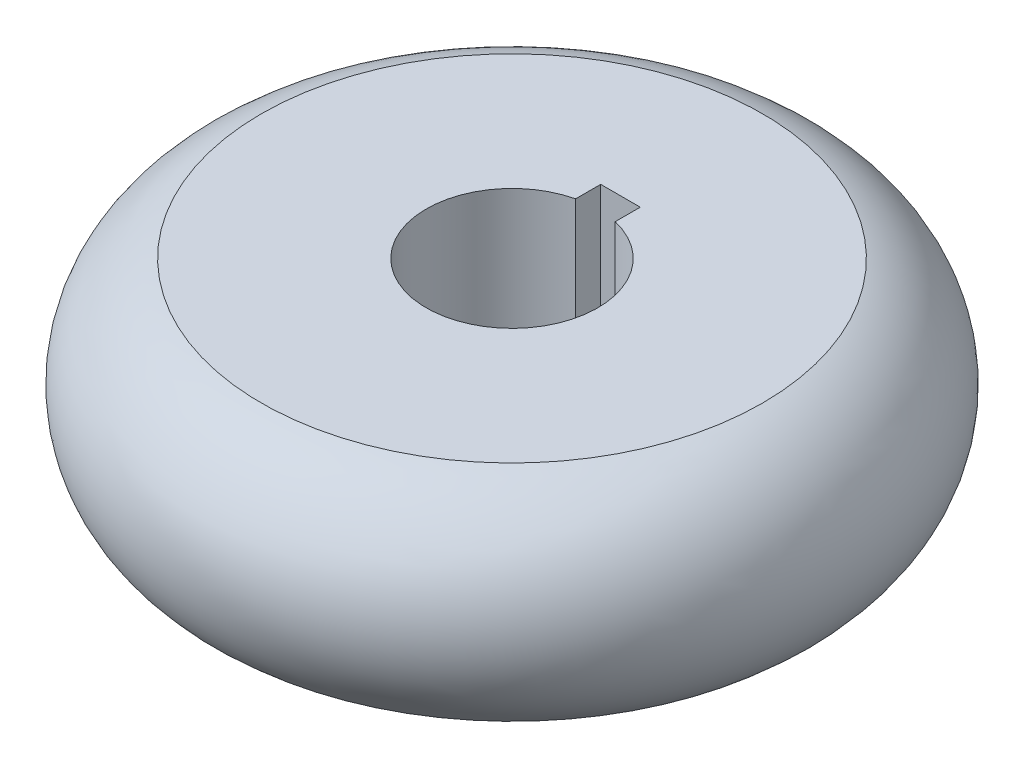
ISO-10303-21;
HEADER;
FILE_DESCRIPTION(('STEP AP214'),'2;1');
FILE_NAME('part.step','',(''),(''),'','','');
FILE_SCHEMA(('AUTOMOTIVE_DESIGN { 1 0 10303 214 1 1 1 1 }'));
ENDSEC;
DATA;
#1=APPLICATION_CONTEXT('core data for automotive mechanical design processes');
#2=APPLICATION_PROTOCOL_DEFINITION('international standard','automotive_design',2000,#1);
#3=PRODUCT_CONTEXT('',#1,'mechanical');
#4=PRODUCT('Part','Part','',(#3));
#5=PRODUCT_RELATED_PRODUCT_CATEGORY('part','',(#4));
#6=PRODUCT_DEFINITION_FORMATION('','',#4);
#7=PRODUCT_DEFINITION_CONTEXT('part definition',#1,'design');
#8=PRODUCT_DEFINITION('design','',#6,#7);
#9=PRODUCT_DEFINITION_SHAPE('','',#8);
#10=(LENGTH_UNIT() NAMED_UNIT(*) SI_UNIT(.MILLI.,.METRE.));
#11=(NAMED_UNIT(*) PLANE_ANGLE_UNIT() SI_UNIT($,.RADIAN.));
#12=(NAMED_UNIT(*) SI_UNIT($,.STERADIAN.) SOLID_ANGLE_UNIT());
#13=UNCERTAINTY_MEASURE_WITH_UNIT(LENGTH_MEASURE(1.E-05),#10,'distance_accuracy_value','');
#14=(GEOMETRIC_REPRESENTATION_CONTEXT(3) GLOBAL_UNCERTAINTY_ASSIGNED_CONTEXT((#13)) GLOBAL_UNIT_ASSIGNED_CONTEXT((#10,
#11,#12)) REPRESENTATION_CONTEXT('',''));
#15=CARTESIAN_POINT('',(0.,0.,0.));
#16=DIRECTION('',(0.,0.,1.));
#17=DIRECTION('',(1.,0.,0.));
#18=AXIS2_PLACEMENT_3D('',#15,#16,#17);
#19=CARTESIAN_POINT('',(-1.50000000000001,8.25,-8.22455532033676));
#20=DIRECTION('',(-1.,0.,0.));
#21=DIRECTION('',(0.,0.,1.));
#22=AXIS2_PLACEMENT_3D('',#19,#20,#21);
#23=PLANE('',#22);
#24=DIRECTION('',(0.,1.,0.));
#25=VECTOR('',#24,1.);
#26=CARTESIAN_POINT('',(-1.5,8.25,-8.22455532033676));
#27=LINE('',#26,#25);
#28=CARTESIAN_POINT('',(-1.5,-8.25,-8.22455532033676));
#29=VERTEX_POINT('',#28);
#30=CARTESIAN_POINT('',(-1.5,8.24999999999999,-8.22455532033676));
#31=VERTEX_POINT('',#30);
#32=EDGE_CURVE('E63',#29,#31,#27,.T.);
#33=ORIENTED_EDGE('',*,*,#32,.T.);
#34=DIRECTION('',(0.,0.,1.));
#35=VECTOR('',#34,1.);
#36=CARTESIAN_POINT('',(-1.5,8.24999999999999,0.));
#37=LINE('',#36,#35);
#38=CARTESIAN_POINT('',(-1.5,8.25,-6.32455532033676));
#39=VERTEX_POINT('',#38);
#40=EDGE_CURVE('E77',#39,#31,#37,.F.);
#41=ORIENTED_EDGE('',*,*,#40,.F.);
#42=DIRECTION('',(0.,1.,0.));
#43=VECTOR('',#42,1.);
#44=CARTESIAN_POINT('',(-1.5,0.,-6.32455532033676));
#45=LINE('',#44,#43);
#46=CARTESIAN_POINT('',(-1.5,-8.25,-6.32455532033676));
#47=VERTEX_POINT('',#46);
#48=EDGE_CURVE('E64',#39,#47,#45,.F.);
#49=ORIENTED_EDGE('',*,*,#48,.T.);
#50=DIRECTION('',(0.,0.,-1.));
#51=VECTOR('',#50,1.);
#52=CARTESIAN_POINT('',(-1.5,-8.25,0.));
#53=LINE('',#52,#51);
#54=EDGE_CURVE('E71',#29,#47,#53,.F.);
#55=ORIENTED_EDGE('',*,*,#54,.F.);
#56=EDGE_LOOP('',(#33,#41,#49,#55));
#57=FACE_BOUND('',#56,.T.);
#58=ADVANCED_FACE('F17',(#57),#23,.F.);
#59=CARTESIAN_POINT('',(0.,0.,0.));
#60=DIRECTION('',(0.,1.,0.));
#61=DIRECTION('',(-1.,0.,0.));
#62=AXIS2_PLACEMENT_3D('',#59,#60,#61);
#63=CYLINDRICAL_SURFACE('',#62,6.5);
#64=CARTESIAN_POINT('',(0.,8.25,0.));
#65=DIRECTION('',(0.,1.,0.));
#66=DIRECTION('',(-1.,0.,0.));
#67=AXIS2_PLACEMENT_3D('',#64,#65,#66);
#68=CIRCLE('',#67,6.5);
#69=CARTESIAN_POINT('',(1.49999999999999,8.25,-6.32455532033676));
#70=VERTEX_POINT('',#69);
#71=EDGE_CURVE('E20',#70,#39,#68,.F.);
#72=ORIENTED_EDGE('',*,*,#71,.F.);
#73=DIRECTION('',(0.,1.,0.));
#74=VECTOR('',#73,1.);
#75=CARTESIAN_POINT('',(1.49999999999999,8.25,-6.32455532033676));
#76=LINE('',#75,#74);
#77=CARTESIAN_POINT('',(1.5,-8.25,-6.32455532033676));
#78=VERTEX_POINT('',#77);
#79=EDGE_CURVE('E52',#70,#78,#76,.F.);
#80=ORIENTED_EDGE('',*,*,#79,.T.);
#81=CARTESIAN_POINT('',(0.,-8.25,0.));
#82=DIRECTION('',(0.,1.,0.));
#83=DIRECTION('',(-1.,0.,0.));
#84=AXIS2_PLACEMENT_3D('',#81,#82,#83);
#85=CIRCLE('',#84,6.5);
#86=EDGE_CURVE('E103',#47,#78,#85,.T.);
#87=ORIENTED_EDGE('',*,*,#86,.F.);
#88=ORIENTED_EDGE('',*,*,#48,.F.);
#89=EDGE_LOOP('',(#72,#80,#87,#88));
#90=FACE_BOUND('',#89,.T.);
#91=ADVANCED_FACE('F68',(#90),#63,.F.);
#92=CARTESIAN_POINT('',(1.49999999999999,8.25,-6.32455532033676));
#93=DIRECTION('',(1.,0.,0.));
#94=DIRECTION('',(0.,0.,-1.));
#95=AXIS2_PLACEMENT_3D('',#92,#93,#94);
#96=PLANE('',#95);
#97=ORIENTED_EDGE('',*,*,#79,.F.);
#98=DIRECTION('',(0.,0.,1.));
#99=VECTOR('',#98,1.);
#100=CARTESIAN_POINT('',(1.49999999999999,8.24999999999999,0.));
#101=LINE('',#100,#99);
#102=CARTESIAN_POINT('',(1.49999999999999,8.24999999999999,-8.22455532033676));
#103=VERTEX_POINT('',#102);
#104=EDGE_CURVE('E56',#103,#70,#101,.T.);
#105=ORIENTED_EDGE('',*,*,#104,.F.);
#106=DIRECTION('',(0.,1.,0.));
#107=VECTOR('',#106,1.);
#108=CARTESIAN_POINT('',(1.49999999999999,8.25,-8.22455532033676));
#109=LINE('',#108,#107);
#110=CARTESIAN_POINT('',(1.5,-8.25,-8.22455532033676));
#111=VERTEX_POINT('',#110);
#112=EDGE_CURVE('E35',#103,#111,#109,.F.);
#113=ORIENTED_EDGE('',*,*,#112,.T.);
#114=DIRECTION('',(0.,0.,-1.));
#115=VECTOR('',#114,1.);
#116=CARTESIAN_POINT('',(1.5,-8.25,0.));
#117=LINE('',#116,#115);
#118=EDGE_CURVE('E59',#78,#111,#117,.T.);
#119=ORIENTED_EDGE('',*,*,#118,.F.);
#120=EDGE_LOOP('',(#97,#105,#113,#119));
#121=FACE_BOUND('',#120,.T.);
#122=ADVANCED_FACE('F54',(#121),#96,.F.);
#123=CARTESIAN_POINT('',(1.49999999999999,8.25,-8.22455532033676));
#124=DIRECTION('',(0.,0.,-1.));
#125=DIRECTION('',(-1.,0.,0.));
#126=AXIS2_PLACEMENT_3D('',#123,#124,#125);
#127=PLANE('',#126);
#128=ORIENTED_EDGE('',*,*,#112,.F.);
#129=DIRECTION('',(1.,0.,0.));
#130=VECTOR('',#129,1.);
#131=CARTESIAN_POINT('',(-12.75,8.24999999999999,-8.22455532033676));
#132=LINE('',#131,#130);
#133=EDGE_CURVE('E75',#31,#103,#132,.T.);
#134=ORIENTED_EDGE('',*,*,#133,.F.);
#135=ORIENTED_EDGE('',*,*,#32,.F.);
#136=DIRECTION('',(1.,0.,0.));
#137=VECTOR('',#136,1.);
#138=CARTESIAN_POINT('',(-12.75,-8.25,-8.22455532033676));
#139=LINE('',#138,#137);
#140=EDGE_CURVE('E88',#111,#29,#139,.F.);
#141=ORIENTED_EDGE('',*,*,#140,.F.);
#142=EDGE_LOOP('',(#128,#134,#135,#141));
#143=FACE_BOUND('',#142,.T.);
#144=ADVANCED_FACE('F121',(#143),#127,.F.);
#145=CARTESIAN_POINT('',(-12.75,8.24999999999999,0.));
#146=DIRECTION('',(0.,1.,0.));
#147=DIRECTION('',(0.,0.,1.));
#148=AXIS2_PLACEMENT_3D('',#145,#146,#147);
#149=PLANE('',#148);
#150=ORIENTED_EDGE('',*,*,#104,.T.);
#151=ORIENTED_EDGE('',*,*,#71,.T.);
#152=ORIENTED_EDGE('',*,*,#40,.T.);
#153=ORIENTED_EDGE('',*,*,#133,.T.);
#154=EDGE_LOOP('',(#150,#151,#152,#153));
#155=FACE_BOUND('',#154,.T.);
#156=CARTESIAN_POINT('',(0.,8.25,0.));
#157=DIRECTION('',(0.,1.,0.));
#158=DIRECTION('',(-1.,0.,0.));
#159=AXIS2_PLACEMENT_3D('',#156,#157,#158);
#160=CIRCLE('',#159,19.);
#161=CARTESIAN_POINT('',(-19.,8.24999999999999,0.));
#162=VERTEX_POINT('',#161);
#163=EDGE_CURVE('E26',#162,#162,#160,.F.);
#164=ORIENTED_EDGE('',*,*,#163,.F.);
#165=EDGE_LOOP('',(#164));
#166=FACE_BOUND('',#165,.T.);
#167=ADVANCED_FACE('F72',(#155,#166),#149,.T.);
#168=CARTESIAN_POINT('',(-12.75,-8.25,0.));
#169=DIRECTION('',(0.,-1.,0.));
#170=DIRECTION('',(0.,0.,-1.));
#171=AXIS2_PLACEMENT_3D('',#168,#169,#170);
#172=PLANE('',#171);
#173=ORIENTED_EDGE('',*,*,#118,.T.);
#174=ORIENTED_EDGE('',*,*,#140,.T.);
#175=ORIENTED_EDGE('',*,*,#54,.T.);
#176=ORIENTED_EDGE('',*,*,#86,.T.);
#177=EDGE_LOOP('',(#173,#174,#175,#176));
#178=FACE_BOUND('',#177,.T.);
#179=CARTESIAN_POINT('',(0.,-8.24999999999999,0.));
#180=DIRECTION('',(0.,1.,0.));
#181=DIRECTION('',(-1.,0.,0.));
#182=AXIS2_PLACEMENT_3D('',#179,#180,#181);
#183=CIRCLE('',#182,19.);
#184=CARTESIAN_POINT('',(-19.,-8.25,0.));
#185=VERTEX_POINT('',#184);
#186=EDGE_CURVE('E11',#185,#185,#183,.T.);
#187=ORIENTED_EDGE('',*,*,#186,.F.);
#188=EDGE_LOOP('',(#187));
#189=FACE_BOUND('',#188,.T.);
#190=ADVANCED_FACE('F115',(#178,#189),#172,.T.);
#191=CARTESIAN_POINT('',(0.,0.,0.));
#192=DIRECTION('',(0.,1.,0.));
#193=DIRECTION('',(0.,0.,1.));
#194=AXIS2_PLACEMENT_3D('',#191,#192,#193);
#195=TOROIDAL_SURFACE('',#194,16.328125,8.671875);
#196=ORIENTED_EDGE('',*,*,#186,.T.);
#197=EDGE_LOOP('',(#196));
#198=FACE_BOUND('',#197,.T.);
#199=ORIENTED_EDGE('',*,*,#163,.T.);
#200=EDGE_LOOP('',(#199));
#201=FACE_BOUND('',#200,.T.);
#202=ADVANCED_FACE('F112',(#198,#201),#195,.T.);
#203=CLOSED_SHELL('',(#58,#91,#122,#144,#167,#190,#202));
#204=MANIFOLD_SOLID_BREP('B1',#203);
#205=ADVANCED_BREP_SHAPE_REPRESENTATION('',(#18,#204),#14);
#206=SHAPE_DEFINITION_REPRESENTATION(#9,#205);
ENDSEC;
END-ISO-10303-21;
